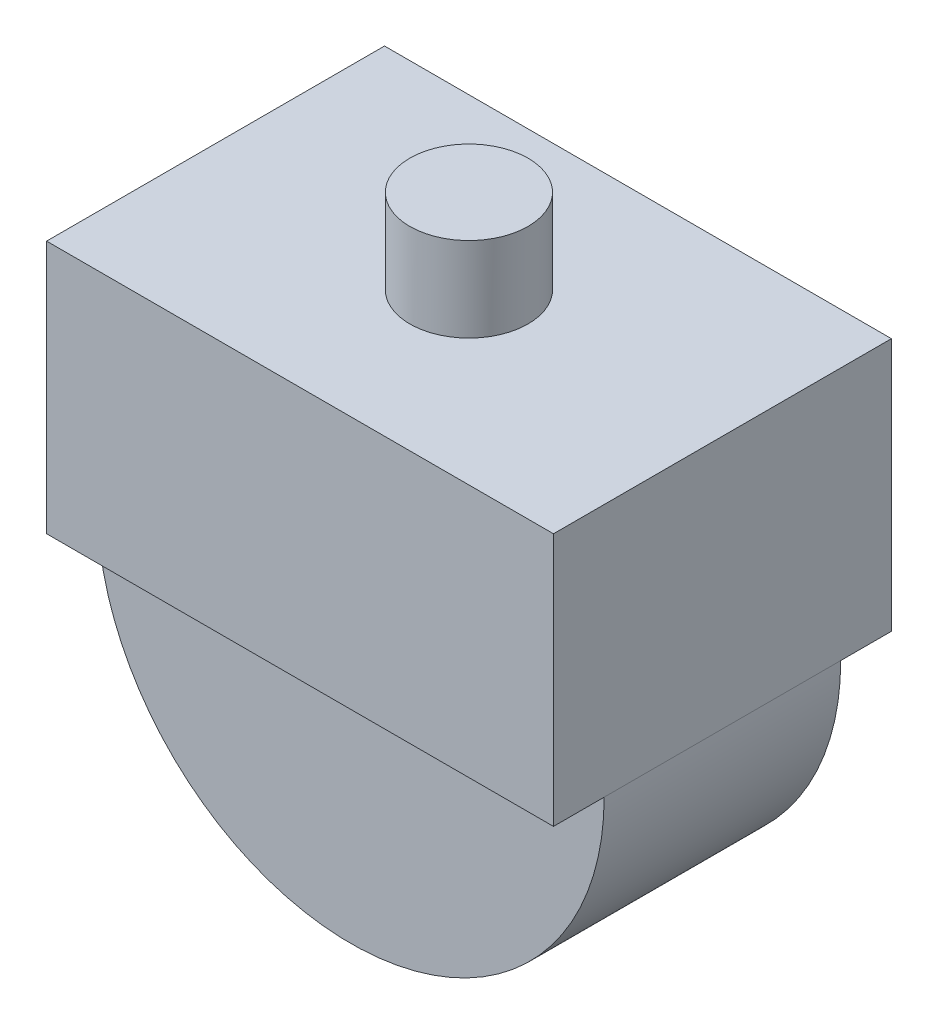
ISO-10303-21;
HEADER;
FILE_DESCRIPTION(('STEP AP214'),'2;1');
FILE_NAME('part.step','',(''),(''),'','','');
FILE_SCHEMA(('AUTOMOTIVE_DESIGN { 1 0 10303 214 1 1 1 1 }'));
ENDSEC;
DATA;
#1=APPLICATION_CONTEXT('core data for automotive mechanical design processes');
#2=APPLICATION_PROTOCOL_DEFINITION('international standard','automotive_design',2000,#1);
#3=PRODUCT_CONTEXT('',#1,'mechanical');
#4=PRODUCT('Part','Part','',(#3));
#5=PRODUCT_RELATED_PRODUCT_CATEGORY('part','',(#4));
#6=PRODUCT_DEFINITION_FORMATION('','',#4);
#7=PRODUCT_DEFINITION_CONTEXT('part definition',#1,'design');
#8=PRODUCT_DEFINITION('design','',#6,#7);
#9=PRODUCT_DEFINITION_SHAPE('','',#8);
#10=(LENGTH_UNIT() NAMED_UNIT(*) SI_UNIT(.MILLI.,.METRE.));
#11=(NAMED_UNIT(*) PLANE_ANGLE_UNIT() SI_UNIT($,.RADIAN.));
#12=(NAMED_UNIT(*) SI_UNIT($,.STERADIAN.) SOLID_ANGLE_UNIT());
#13=UNCERTAINTY_MEASURE_WITH_UNIT(LENGTH_MEASURE(1.E-05),#10,'distance_accuracy_value','');
#14=(GEOMETRIC_REPRESENTATION_CONTEXT(3) GLOBAL_UNCERTAINTY_ASSIGNED_CONTEXT((#13)) GLOBAL_UNIT_ASSIGNED_CONTEXT((#10,
#11,#12)) REPRESENTATION_CONTEXT('',''));
#15=CARTESIAN_POINT('',(0.,0.,0.));
#16=DIRECTION('',(0.,0.,1.));
#17=DIRECTION('',(1.,0.,0.));
#18=AXIS2_PLACEMENT_3D('',#15,#16,#17);
#19=CARTESIAN_POINT('',(15.,15.,14.));
#20=DIRECTION('',(0.,-1.,0.));
#21=DIRECTION('',(0.,0.,-1.));
#22=AXIS2_PLACEMENT_3D('',#19,#20,#21);
#23=PLANE('',#22);
#24=DIRECTION('',(0.,0.,-1.));
#25=VECTOR('',#24,1.);
#26=CARTESIAN_POINT('',(15.,15.,14.));
#27=LINE('',#26,#25);
#28=CARTESIAN_POINT('',(15.,15.,17.));
#29=VERTEX_POINT('',#28);
#30=CARTESIAN_POINT('',(15.,15.,-3.));
#31=VERTEX_POINT('',#30);
#32=EDGE_CURVE('E39',#29,#31,#27,.T.);
#33=ORIENTED_EDGE('',*,*,#32,.T.);
#34=DIRECTION('',(1.,0.,0.));
#35=VECTOR('',#34,1.);
#36=CARTESIAN_POINT('',(-15.,15.,-3.));
#37=LINE('',#36,#35);
#38=CARTESIAN_POINT('',(-15.,15.,-3.));
#39=VERTEX_POINT('',#38);
#40=EDGE_CURVE('E143',#39,#31,#37,.T.);
#41=ORIENTED_EDGE('',*,*,#40,.F.);
#42=DIRECTION('',(0.,0.,-1.));
#43=VECTOR('',#42,1.);
#44=CARTESIAN_POINT('',(-15.,15.,14.));
#45=LINE('',#44,#43);
#46=CARTESIAN_POINT('',(-15.,15.,17.));
#47=VERTEX_POINT('',#46);
#48=EDGE_CURVE('E137',#47,#39,#45,.T.);
#49=ORIENTED_EDGE('',*,*,#48,.F.);
#50=DIRECTION('',(-1.,0.,0.));
#51=VECTOR('',#50,1.);
#52=CARTESIAN_POINT('',(15.,15.,17.));
#53=LINE('',#52,#51);
#54=EDGE_CURVE('E115',#29,#47,#53,.T.);
#55=ORIENTED_EDGE('',*,*,#54,.F.);
#56=EDGE_LOOP('',(#33,#41,#49,#55));
#57=FACE_BOUND('',#56,.T.);
#58=CARTESIAN_POINT('',(-0.00432527796816821,15.,7.));
#59=DIRECTION('',(0.,-1.,0.));
#60=DIRECTION('',(0.,0.,-1.));
#61=AXIS2_PLACEMENT_3D('',#58,#59,#60);
#62=CIRCLE('',#61,3.5);
#63=CARTESIAN_POINT('',(-0.00432527796816821,15.,3.5));
#64=VERTEX_POINT('',#63);
#65=EDGE_CURVE('E11',#64,#64,#62,.F.);
#66=ORIENTED_EDGE('',*,*,#65,.F.);
#67=EDGE_LOOP('',(#66));
#68=FACE_BOUND('',#67,.T.);
#69=ADVANCED_FACE('F31',(#57,#68),#23,.F.);
#70=CARTESIAN_POINT('',(0.,0.,0.));
#71=DIRECTION('',(0.,0.,1.));
#72=DIRECTION('',(1.,0.,0.));
#73=AXIS2_PLACEMENT_3D('',#70,#71,#72);
#74=PLANE('',#73);
#75=DIRECTION('',(-1.,0.,0.));
#76=VECTOR('',#75,1.);
#77=CARTESIAN_POINT('',(-15.,0.,0.));
#78=LINE('',#77,#76);
#79=CARTESIAN_POINT('',(-2.9928174770822,0.,0.));
#80=VERTEX_POINT('',#79);
#81=CARTESIAN_POINT('',(-15.,0.,0.));
#82=VERTEX_POINT('',#81);
#83=EDGE_CURVE('E167',#80,#82,#78,.T.);
#84=ORIENTED_EDGE('',*,*,#83,.F.);
#85=CARTESIAN_POINT('',(0.,0.,0.));
#86=DIRECTION('',(0.,0.,1.));
#87=DIRECTION('',(1.,0.,0.));
#88=AXIS2_PLACEMENT_3D('',#85,#86,#87);
#89=CIRCLE('',#88,2.9928174770822);
#90=CARTESIAN_POINT('',(2.9928174770822,0.,0.));
#91=VERTEX_POINT('',#90);
#92=EDGE_CURVE('E95',#80,#91,#89,.T.);
#93=ORIENTED_EDGE('',*,*,#92,.T.);
#94=CARTESIAN_POINT('',(15.,0.,0.));
#95=VERTEX_POINT('',#94);
#96=EDGE_CURVE('E164',#95,#91,#78,.T.);
#97=ORIENTED_EDGE('',*,*,#96,.F.);
#98=CARTESIAN_POINT('',(0.,0.,0.));
#99=DIRECTION('',(0.,0.,1.));
#100=DIRECTION('',(1.,0.,0.));
#101=AXIS2_PLACEMENT_3D('',#98,#99,#100);
#102=CIRCLE('',#101,15.);
#103=EDGE_CURVE('E126',#82,#95,#102,.T.);
#104=ORIENTED_EDGE('',*,*,#103,.F.);
#105=EDGE_LOOP('',(#84,#93,#97,#104));
#106=FACE_BOUND('',#105,.T.);
#107=ADVANCED_FACE('F189',(#106),#74,.F.);
#108=CARTESIAN_POINT('',(15.,15.,14.));
#109=DIRECTION('',(-1.,0.,0.));
#110=DIRECTION('',(0.,-1.,0.));
#111=AXIS2_PLACEMENT_3D('',#108,#109,#110);
#112=PLANE('',#111);
#113=DIRECTION('',(0.,0.,-1.));
#114=VECTOR('',#113,1.);
#115=CARTESIAN_POINT('',(15.,0.,14.));
#116=LINE('',#115,#114);
#117=CARTESIAN_POINT('',(15.,-1.04744500833281E-13,14.));
#118=VERTEX_POINT('',#117);
#119=EDGE_CURVE('E129',#118,#95,#116,.T.);
#120=ORIENTED_EDGE('',*,*,#119,.T.);
#121=DIRECTION('',(0.,0.,1.));
#122=VECTOR('',#121,1.);
#123=CARTESIAN_POINT('',(15.,0.,-3.));
#124=LINE('',#123,#122);
#125=CARTESIAN_POINT('',(15.,0.,-3.));
#126=VERTEX_POINT('',#125);
#127=EDGE_CURVE('E117',#126,#95,#124,.T.);
#128=ORIENTED_EDGE('',*,*,#127,.F.);
#129=DIRECTION('',(0.,-1.,0.));
#130=VECTOR('',#129,1.);
#131=CARTESIAN_POINT('',(15.,15.,-3.));
#132=LINE('',#131,#130);
#133=EDGE_CURVE('E151',#31,#126,#132,.T.);
#134=ORIENTED_EDGE('',*,*,#133,.F.);
#135=ORIENTED_EDGE('',*,*,#32,.F.);
#136=DIRECTION('',(0.,1.,0.));
#137=VECTOR('',#136,1.);
#138=CARTESIAN_POINT('',(15.,15.,17.));
#139=LINE('',#138,#137);
#140=CARTESIAN_POINT('',(15.,-1.04744500833281E-13,17.));
#141=VERTEX_POINT('',#140);
#142=EDGE_CURVE('E112',#141,#29,#139,.T.);
#143=ORIENTED_EDGE('',*,*,#142,.F.);
#144=DIRECTION('',(0.,0.,-1.));
#145=VECTOR('',#144,1.);
#146=CARTESIAN_POINT('',(15.,-1.04744500833281E-13,17.));
#147=LINE('',#146,#145);
#148=EDGE_CURVE('E122',#141,#118,#147,.T.);
#149=ORIENTED_EDGE('',*,*,#148,.T.);
#150=EDGE_LOOP('',(#120,#128,#134,#135,#143,#149));
#151=FACE_BOUND('',#150,.T.);
#152=ADVANCED_FACE('F33',(#151),#112,.F.);
#153=CARTESIAN_POINT('',(-15.,15.,14.));
#154=DIRECTION('',(1.,0.,0.));
#155=DIRECTION('',(0.,1.,0.));
#156=AXIS2_PLACEMENT_3D('',#153,#154,#155);
#157=PLANE('',#156);
#158=ORIENTED_EDGE('',*,*,#48,.T.);
#159=DIRECTION('',(0.,1.,0.));
#160=VECTOR('',#159,1.);
#161=CARTESIAN_POINT('',(-15.,15.,-3.));
#162=LINE('',#161,#160);
#163=CARTESIAN_POINT('',(-15.,0.,-3.));
#164=VERTEX_POINT('',#163);
#165=EDGE_CURVE('E154',#164,#39,#162,.T.);
#166=ORIENTED_EDGE('',*,*,#165,.F.);
#167=DIRECTION('',(0.,0.,1.));
#168=VECTOR('',#167,1.);
#169=CARTESIAN_POINT('',(-15.,0.,-3.));
#170=LINE('',#169,#168);
#171=EDGE_CURVE('E160',#164,#82,#170,.T.);
#172=ORIENTED_EDGE('',*,*,#171,.T.);
#173=DIRECTION('',(0.,0.,-1.));
#174=VECTOR('',#173,1.);
#175=CARTESIAN_POINT('',(-15.,0.,14.));
#176=LINE('',#175,#174);
#177=CARTESIAN_POINT('',(-15.,0.,14.));
#178=VERTEX_POINT('',#177);
#179=EDGE_CURVE('E134',#178,#82,#176,.T.);
#180=ORIENTED_EDGE('',*,*,#179,.F.);
#181=DIRECTION('',(0.,0.,-1.));
#182=VECTOR('',#181,1.);
#183=CARTESIAN_POINT('',(-15.,-1.04744500833281E-13,17.));
#184=LINE('',#183,#182);
#185=CARTESIAN_POINT('',(-15.,-1.04744500833281E-13,17.));
#186=VERTEX_POINT('',#185);
#187=EDGE_CURVE('E111',#186,#178,#184,.T.);
#188=ORIENTED_EDGE('',*,*,#187,.F.);
#189=DIRECTION('',(0.,-1.,0.));
#190=VECTOR('',#189,1.);
#191=CARTESIAN_POINT('',(-15.,15.,17.));
#192=LINE('',#191,#190);
#193=EDGE_CURVE('E171',#47,#186,#192,.T.);
#194=ORIENTED_EDGE('',*,*,#193,.F.);
#195=EDGE_LOOP('',(#158,#166,#172,#180,#188,#194));
#196=FACE_BOUND('',#195,.T.);
#197=ADVANCED_FACE('F182',(#196),#157,.F.);
#198=CARTESIAN_POINT('',(0.,0.,14.));
#199=DIRECTION('',(0.,0.,-1.));
#200=DIRECTION('',(-1.,0.,0.));
#201=AXIS2_PLACEMENT_3D('',#198,#199,#200);
#202=CYLINDRICAL_SURFACE('',#201,15.);
#203=ORIENTED_EDGE('',*,*,#103,.T.);
#204=ORIENTED_EDGE('',*,*,#119,.F.);
#205=CARTESIAN_POINT('',(0.,0.,14.));
#206=DIRECTION('',(0.,0.,1.));
#207=DIRECTION('',(1.,0.,0.));
#208=AXIS2_PLACEMENT_3D('',#205,#206,#207);
#209=CIRCLE('',#208,15.);
#210=EDGE_CURVE('E127',#178,#118,#209,.T.);
#211=ORIENTED_EDGE('',*,*,#210,.F.);
#212=ORIENTED_EDGE('',*,*,#179,.T.);
#213=EDGE_LOOP('',(#203,#204,#211,#212));
#214=FACE_BOUND('',#213,.T.);
#215=ADVANCED_FACE('F190',(#214),#202,.T.);
#216=CARTESIAN_POINT('',(0.,0.,14.));
#217=DIRECTION('',(0.,0.,1.));
#218=DIRECTION('',(1.,0.,0.));
#219=AXIS2_PLACEMENT_3D('',#216,#217,#218);
#220=PLANE('',#219);
#221=CARTESIAN_POINT('',(0.,0.,14.));
#222=DIRECTION('',(0.,0.,1.));
#223=DIRECTION('',(1.,0.,0.));
#224=AXIS2_PLACEMENT_3D('',#221,#222,#223);
#225=CIRCLE('',#224,2.9928174770822);
#226=CARTESIAN_POINT('',(-2.9928174770822,0.,14.));
#227=VERTEX_POINT('',#226);
#228=CARTESIAN_POINT('',(2.9928174770822,-1.04744500833281E-13,14.));
#229=VERTEX_POINT('',#228);
#230=EDGE_CURVE('E46',#227,#229,#225,.T.);
#231=ORIENTED_EDGE('',*,*,#230,.F.);
#232=DIRECTION('',(1.,0.,0.));
#233=VECTOR('',#232,1.);
#234=CARTESIAN_POINT('',(15.,-1.04744500833281E-13,14.));
#235=LINE('',#234,#233);
#236=EDGE_CURVE('E103',#178,#227,#235,.T.);
#237=ORIENTED_EDGE('',*,*,#236,.F.);
#238=ORIENTED_EDGE('',*,*,#210,.T.);
#239=EDGE_CURVE('E105',#229,#118,#235,.T.);
#240=ORIENTED_EDGE('',*,*,#239,.F.);
#241=EDGE_LOOP('',(#231,#237,#238,#240));
#242=FACE_BOUND('',#241,.T.);
#243=ADVANCED_FACE('F101',(#242),#220,.T.);
#244=CARTESIAN_POINT('',(15.,-1.04744500833281E-13,17.));
#245=DIRECTION('',(0.,1.,0.));
#246=DIRECTION('',(0.,0.,1.));
#247=AXIS2_PLACEMENT_3D('',#244,#245,#246);
#248=PLANE('',#247);
#249=ORIENTED_EDGE('',*,*,#236,.T.);
#250=DIRECTION('',(0.,0.,1.));
#251=VECTOR('',#250,1.);
#252=CARTESIAN_POINT('',(-2.9928174770822,0.,-4.));
#253=LINE('',#252,#251);
#254=EDGE_CURVE('E53',#80,#227,#253,.T.);
#255=ORIENTED_EDGE('',*,*,#254,.F.);
#256=ORIENTED_EDGE('',*,*,#83,.T.);
#257=ORIENTED_EDGE('',*,*,#171,.F.);
#258=DIRECTION('',(-1.,0.,0.));
#259=VECTOR('',#258,1.);
#260=CARTESIAN_POINT('',(-15.,0.,-3.));
#261=LINE('',#260,#259);
#262=EDGE_CURVE('E158',#126,#164,#261,.T.);
#263=ORIENTED_EDGE('',*,*,#262,.F.);
#264=ORIENTED_EDGE('',*,*,#127,.T.);
#265=ORIENTED_EDGE('',*,*,#96,.T.);
#266=DIRECTION('',(0.,0.,1.));
#267=VECTOR('',#266,1.);
#268=CARTESIAN_POINT('',(2.9928174770822,0.,-4.));
#269=LINE('',#268,#267);
#270=EDGE_CURVE('E97',#91,#229,#269,.T.);
#271=ORIENTED_EDGE('',*,*,#270,.T.);
#272=ORIENTED_EDGE('',*,*,#239,.T.);
#273=ORIENTED_EDGE('',*,*,#148,.F.);
#274=DIRECTION('',(1.,0.,0.));
#275=VECTOR('',#274,1.);
#276=CARTESIAN_POINT('',(15.,-1.04744500833281E-13,17.));
#277=LINE('',#276,#275);
#278=EDGE_CURVE('E120',#186,#141,#277,.T.);
#279=ORIENTED_EDGE('',*,*,#278,.F.);
#280=ORIENTED_EDGE('',*,*,#187,.T.);
#281=EDGE_LOOP('',(#249,#255,#256,#257,#263,#264,#265,#271,#272,#273,#279,#280));
#282=FACE_BOUND('',#281,.T.);
#283=ADVANCED_FACE('F108',(#282),#248,.F.);
#284=CARTESIAN_POINT('',(15.,-1.04744500833281E-13,17.));
#285=DIRECTION('',(0.,0.,-1.));
#286=DIRECTION('',(-1.,0.,0.));
#287=AXIS2_PLACEMENT_3D('',#284,#285,#286);
#288=PLANE('',#287);
#289=ORIENTED_EDGE('',*,*,#142,.T.);
#290=ORIENTED_EDGE('',*,*,#54,.T.);
#291=ORIENTED_EDGE('',*,*,#193,.T.);
#292=ORIENTED_EDGE('',*,*,#278,.T.);
#293=EDGE_LOOP('',(#289,#290,#291,#292));
#294=FACE_BOUND('',#293,.T.);
#295=ADVANCED_FACE('F175',(#294),#288,.F.);
#296=CARTESIAN_POINT('',(-15.,0.,-3.));
#297=DIRECTION('',(0.,0.,1.));
#298=DIRECTION('',(1.,0.,0.));
#299=AXIS2_PLACEMENT_3D('',#296,#297,#298);
#300=PLANE('',#299);
#301=ORIENTED_EDGE('',*,*,#165,.T.);
#302=ORIENTED_EDGE('',*,*,#40,.T.);
#303=ORIENTED_EDGE('',*,*,#133,.T.);
#304=ORIENTED_EDGE('',*,*,#262,.T.);
#305=EDGE_LOOP('',(#301,#302,#303,#304));
#306=FACE_BOUND('',#305,.T.);
#307=ADVANCED_FACE('F150',(#306),#300,.F.);
#308=CARTESIAN_POINT('',(-0.00432527796816821,20.,7.));
#309=DIRECTION('',(0.,-1.,0.));
#310=DIRECTION('',(0.,0.,-1.));
#311=AXIS2_PLACEMENT_3D('',#308,#309,#310);
#312=CYLINDRICAL_SURFACE('',#311,3.5);
#313=CARTESIAN_POINT('',(-0.00432527796816821,20.,7.));
#314=DIRECTION('',(0.,1.,0.));
#315=DIRECTION('',(0.,0.,1.));
#316=AXIS2_PLACEMENT_3D('',#313,#314,#315);
#317=CIRCLE('',#316,3.5);
#318=CARTESIAN_POINT('',(-0.00432527796816821,20.,10.5));
#319=VERTEX_POINT('',#318);
#320=EDGE_CURVE('E184',#319,#319,#317,.T.);
#321=ORIENTED_EDGE('',*,*,#320,.F.);
#322=EDGE_LOOP('',(#321));
#323=FACE_BOUND('',#322,.T.);
#324=ORIENTED_EDGE('',*,*,#65,.T.);
#325=EDGE_LOOP('',(#324));
#326=FACE_BOUND('',#325,.T.);
#327=ADVANCED_FACE('F214',(#323,#326),#312,.T.);
#328=CARTESIAN_POINT('',(-0.00432527796816821,20.,7.));
#329=DIRECTION('',(0.,1.,0.));
#330=DIRECTION('',(0.,0.,1.));
#331=AXIS2_PLACEMENT_3D('',#328,#329,#330);
#332=PLANE('',#331);
#333=ORIENTED_EDGE('',*,*,#320,.T.);
#334=EDGE_LOOP('',(#333));
#335=FACE_BOUND('',#334,.T.);
#336=ADVANCED_FACE('F217',(#335),#332,.T.);
#337=CARTESIAN_POINT('',(0.,0.,-4.));
#338=DIRECTION('',(0.,0.,1.));
#339=DIRECTION('',(1.,0.,0.));
#340=AXIS2_PLACEMENT_3D('',#337,#338,#339);
#341=CYLINDRICAL_SURFACE('',#340,2.9928174770822);
#342=ORIENTED_EDGE('',*,*,#254,.T.);
#343=ORIENTED_EDGE('',*,*,#230,.T.);
#344=ORIENTED_EDGE('',*,*,#270,.F.);
#345=ORIENTED_EDGE('',*,*,#92,.F.);
#346=EDGE_LOOP('',(#342,#343,#344,#345));
#347=FACE_BOUND('',#346,.T.);
#348=ADVANCED_FACE('F93',(#347),#341,.F.);
#349=CLOSED_SHELL('',(#69,#107,#152,#197,#215,#243,#283,#295,#307,#327,#336,#348));
#350=MANIFOLD_SOLID_BREP('B2',#349);
#351=ADVANCED_BREP_SHAPE_REPRESENTATION('',(#18,#350),#14);
#352=SHAPE_DEFINITION_REPRESENTATION(#9,#351);
ENDSEC;
END-ISO-10303-21;
